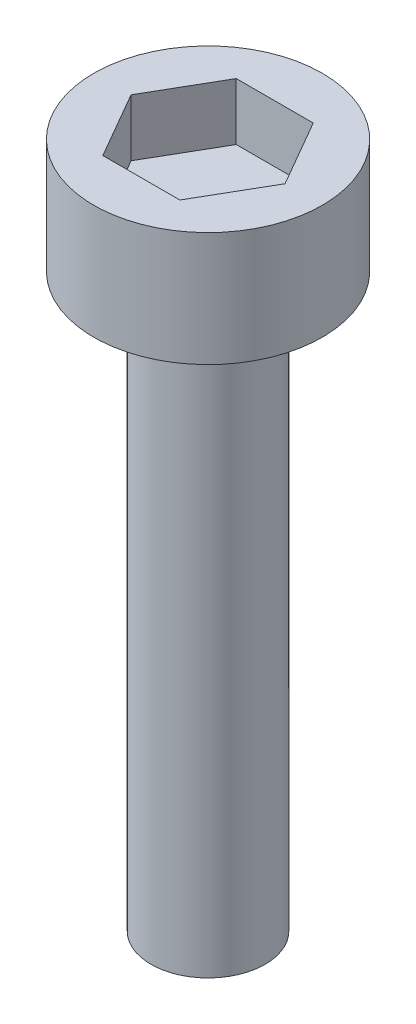
ISO-10303-21;
HEADER;
FILE_DESCRIPTION(('STEP AP214'),'2;1');
FILE_NAME('part.step','',(''),(''),'','','');
FILE_SCHEMA(('AUTOMOTIVE_DESIGN { 1 0 10303 214 1 1 1 1 }'));
ENDSEC;
DATA;
#1=APPLICATION_CONTEXT('core data for automotive mechanical design processes');
#2=APPLICATION_PROTOCOL_DEFINITION('international standard','automotive_design',2000,#1);
#3=PRODUCT_CONTEXT('',#1,'mechanical');
#4=PRODUCT('Part','Part','',(#3));
#5=PRODUCT_RELATED_PRODUCT_CATEGORY('part','',(#4));
#6=PRODUCT_DEFINITION_FORMATION('','',#4);
#7=PRODUCT_DEFINITION_CONTEXT('part definition',#1,'design');
#8=PRODUCT_DEFINITION('design','',#6,#7);
#9=PRODUCT_DEFINITION_SHAPE('','',#8);
#10=(LENGTH_UNIT() NAMED_UNIT(*) SI_UNIT(.MILLI.,.METRE.));
#11=(NAMED_UNIT(*) PLANE_ANGLE_UNIT() SI_UNIT($,.RADIAN.));
#12=(NAMED_UNIT(*) SI_UNIT($,.STERADIAN.) SOLID_ANGLE_UNIT());
#13=UNCERTAINTY_MEASURE_WITH_UNIT(LENGTH_MEASURE(1.E-05),#10,'distance_accuracy_value','');
#14=(GEOMETRIC_REPRESENTATION_CONTEXT(3) GLOBAL_UNCERTAINTY_ASSIGNED_CONTEXT((#13)) GLOBAL_UNIT_ASSIGNED_CONTEXT((#10,
#11,#12)) REPRESENTATION_CONTEXT('',''));
#15=CARTESIAN_POINT('',(0.,0.,0.));
#16=DIRECTION('',(0.,0.,1.));
#17=DIRECTION('',(1.,0.,0.));
#18=AXIS2_PLACEMENT_3D('',#15,#16,#17);
#19=CARTESIAN_POINT('',(0.,0.,0.));
#20=DIRECTION('',(0.,-1.,0.));
#21=DIRECTION('',(0.,0.,-1.));
#22=AXIS2_PLACEMENT_3D('',#19,#20,#21);
#23=PLANE('',#22);
#24=CARTESIAN_POINT('',(0.,0.,0.));
#25=DIRECTION('',(0.,-1.,0.));
#26=DIRECTION('',(0.,0.,-1.));
#27=AXIS2_PLACEMENT_3D('',#24,#25,#26);
#28=CIRCLE('',#27,3.);
#29=CARTESIAN_POINT('',(0.,0.,-3.));
#30=VERTEX_POINT('',#29);
#31=EDGE_CURVE('E11',#30,#30,#28,.T.);
#32=ORIENTED_EDGE('',*,*,#31,.T.);
#33=EDGE_LOOP('',(#32));
#34=FACE_BOUND('',#33,.T.);
#35=ADVANCED_FACE('F33',(#34),#23,.T.);
#36=CARTESIAN_POINT('',(0.,0.,0.));
#37=DIRECTION('',(0.,-1.,0.));
#38=DIRECTION('',(0.,0.,-1.));
#39=AXIS2_PLACEMENT_3D('',#36,#37,#38);
#40=CYLINDRICAL_SURFACE('',#39,3.);
#41=CARTESIAN_POINT('',(0.,30.,0.));
#42=DIRECTION('',(0.,-1.,0.));
#43=DIRECTION('',(0.,0.,-1.));
#44=AXIS2_PLACEMENT_3D('',#41,#42,#43);
#45=CIRCLE('',#44,3.);
#46=CARTESIAN_POINT('',(0.,30.,-3.));
#47=VERTEX_POINT('',#46);
#48=EDGE_CURVE('E40',#47,#47,#45,.T.);
#49=ORIENTED_EDGE('',*,*,#48,.T.);
#50=EDGE_LOOP('',(#49));
#51=FACE_BOUND('',#50,.T.);
#52=ORIENTED_EDGE('',*,*,#31,.F.);
#53=EDGE_LOOP('',(#52));
#54=FACE_BOUND('',#53,.T.);
#55=ADVANCED_FACE('F147',(#51,#54),#40,.T.);
#56=CARTESIAN_POINT('',(3.,30.,0.));
#57=DIRECTION('',(0.,-1.,0.));
#58=DIRECTION('',(0.,0.,-1.));
#59=AXIS2_PLACEMENT_3D('',#56,#57,#58);
#60=PLANE('',#59);
#61=CARTESIAN_POINT('',(0.,30.,0.));
#62=DIRECTION('',(0.,-1.,0.));
#63=DIRECTION('',(0.,0.,-1.));
#64=AXIS2_PLACEMENT_3D('',#61,#62,#63);
#65=CIRCLE('',#64,6.);
#66=CARTESIAN_POINT('',(0.,30.,-6.));
#67=VERTEX_POINT('',#66);
#68=EDGE_CURVE('E142',#67,#67,#65,.T.);
#69=ORIENTED_EDGE('',*,*,#68,.T.);
#70=EDGE_LOOP('',(#69));
#71=FACE_BOUND('',#70,.T.);
#72=ORIENTED_EDGE('',*,*,#48,.F.);
#73=EDGE_LOOP('',(#72));
#74=FACE_BOUND('',#73,.T.);
#75=ADVANCED_FACE('F150',(#71,#74),#60,.T.);
#76=CARTESIAN_POINT('',(0.,0.,0.));
#77=DIRECTION('',(0.,-1.,0.));
#78=DIRECTION('',(0.,0.,-1.));
#79=AXIS2_PLACEMENT_3D('',#76,#77,#78);
#80=CYLINDRICAL_SURFACE('',#79,6.);
#81=CARTESIAN_POINT('',(0.,36.,0.));
#82=DIRECTION('',(0.,-1.,0.));
#83=DIRECTION('',(0.,0.,-1.));
#84=AXIS2_PLACEMENT_3D('',#81,#82,#83);
#85=CIRCLE('',#84,6.);
#86=CARTESIAN_POINT('',(0.,36.,-6.));
#87=VERTEX_POINT('',#86);
#88=EDGE_CURVE('E134',#87,#87,#85,.T.);
#89=ORIENTED_EDGE('',*,*,#88,.T.);
#90=EDGE_LOOP('',(#89));
#91=FACE_BOUND('',#90,.T.);
#92=ORIENTED_EDGE('',*,*,#68,.F.);
#93=EDGE_LOOP('',(#92));
#94=FACE_BOUND('',#93,.T.);
#95=ADVANCED_FACE('F152',(#91,#94),#80,.T.);
#96=CARTESIAN_POINT('',(6.,36.,0.));
#97=DIRECTION('',(0.,1.,0.));
#98=DIRECTION('',(0.,0.,1.));
#99=AXIS2_PLACEMENT_3D('',#96,#97,#98);
#100=PLANE('',#99);
#101=DIRECTION('',(-0.5,0.,-0.866025403784439));
#102=VECTOR('',#101,1.);
#103=CARTESIAN_POINT('',(4.04145188432738,36.,0.));
#104=LINE('',#103,#102);
#105=CARTESIAN_POINT('',(4.04145188432738,36.,0.));
#106=VERTEX_POINT('',#105);
#107=CARTESIAN_POINT('',(2.02072594216369,36.,-3.5));
#108=VERTEX_POINT('',#107);
#109=EDGE_CURVE('E47',#106,#108,#104,.T.);
#110=ORIENTED_EDGE('',*,*,#109,.F.);
#111=DIRECTION('',(0.5,0.,-0.866025403784439));
#112=VECTOR('',#111,1.);
#113=CARTESIAN_POINT('',(2.02072594216369,36.,3.5));
#114=LINE('',#113,#112);
#115=CARTESIAN_POINT('',(2.02072594216369,36.,3.5));
#116=VERTEX_POINT('',#115);
#117=EDGE_CURVE('E130',#116,#106,#114,.T.);
#118=ORIENTED_EDGE('',*,*,#117,.F.);
#119=DIRECTION('',(1.,0.,0.));
#120=VECTOR('',#119,1.);
#121=CARTESIAN_POINT('',(-2.02072594216369,36.,3.5));
#122=LINE('',#121,#120);
#123=CARTESIAN_POINT('',(-2.02072594216369,36.,3.5));
#124=VERTEX_POINT('',#123);
#125=EDGE_CURVE('E128',#124,#116,#122,.T.);
#126=ORIENTED_EDGE('',*,*,#125,.F.);
#127=DIRECTION('',(0.5,0.,0.866025403784439));
#128=VECTOR('',#127,1.);
#129=CARTESIAN_POINT('',(-4.04145188432738,36.,0.));
#130=LINE('',#129,#128);
#131=CARTESIAN_POINT('',(-4.04145188432738,36.,0.));
#132=VERTEX_POINT('',#131);
#133=EDGE_CURVE('E95',#132,#124,#130,.T.);
#134=ORIENTED_EDGE('',*,*,#133,.F.);
#135=DIRECTION('',(-0.5,0.,0.866025403784439));
#136=VECTOR('',#135,1.);
#137=CARTESIAN_POINT('',(-2.02072594216369,36.,-3.5));
#138=LINE('',#137,#136);
#139=CARTESIAN_POINT('',(-2.02072594216369,36.,-3.5));
#140=VERTEX_POINT('',#139);
#141=EDGE_CURVE('E124',#140,#132,#138,.T.);
#142=ORIENTED_EDGE('',*,*,#141,.F.);
#143=DIRECTION('',(-1.,0.,0.));
#144=VECTOR('',#143,1.);
#145=CARTESIAN_POINT('',(2.02072594216369,36.,-3.5));
#146=LINE('',#145,#144);
#147=EDGE_CURVE('E121',#108,#140,#146,.T.);
#148=ORIENTED_EDGE('',*,*,#147,.F.);
#149=EDGE_LOOP('',(#110,#118,#126,#134,#142,#148));
#150=FACE_BOUND('',#149,.T.);
#151=ORIENTED_EDGE('',*,*,#88,.F.);
#152=EDGE_LOOP('',(#151));
#153=FACE_BOUND('',#152,.T.);
#154=ADVANCED_FACE('F159',(#150,#153),#100,.T.);
#155=CARTESIAN_POINT('',(4.04145188432738,33.,0.));
#156=DIRECTION('',(0.866025403784439,0.,-0.5));
#157=DIRECTION('',(-0.5,0.,-0.866025403784439));
#158=AXIS2_PLACEMENT_3D('',#155,#156,#157);
#159=PLANE('',#158);
#160=ORIENTED_EDGE('',*,*,#109,.T.);
#161=DIRECTION('',(0.,1.,0.));
#162=VECTOR('',#161,1.);
#163=CARTESIAN_POINT('',(2.02072594216369,33.,-3.5));
#164=LINE('',#163,#162);
#165=CARTESIAN_POINT('',(2.02072594216369,33.,-3.5));
#166=VERTEX_POINT('',#165);
#167=EDGE_CURVE('E77',#166,#108,#164,.T.);
#168=ORIENTED_EDGE('',*,*,#167,.F.);
#169=DIRECTION('',(-0.5,0.,-0.866025403784439));
#170=VECTOR('',#169,1.);
#171=CARTESIAN_POINT('',(4.04145188432738,33.,0.));
#172=LINE('',#171,#170);
#173=CARTESIAN_POINT('',(4.04145188432738,33.,0.));
#174=VERTEX_POINT('',#173);
#175=EDGE_CURVE('E132',#174,#166,#172,.T.);
#176=ORIENTED_EDGE('',*,*,#175,.F.);
#177=DIRECTION('',(0.,1.,0.));
#178=VECTOR('',#177,1.);
#179=CARTESIAN_POINT('',(4.04145188432738,33.,0.));
#180=LINE('',#179,#178);
#181=EDGE_CURVE('E55',#174,#106,#180,.T.);
#182=ORIENTED_EDGE('',*,*,#181,.T.);
#183=EDGE_LOOP('',(#160,#168,#176,#182));
#184=FACE_BOUND('',#183,.T.);
#185=ADVANCED_FACE('F190',(#184),#159,.F.);
#186=CARTESIAN_POINT('',(2.02072594216369,33.,3.5));
#187=DIRECTION('',(0.866025403784438,0.,0.5));
#188=DIRECTION('',(0.5,0.,-0.866025403784439));
#189=AXIS2_PLACEMENT_3D('',#186,#187,#188);
#190=PLANE('',#189);
#191=ORIENTED_EDGE('',*,*,#117,.T.);
#192=ORIENTED_EDGE('',*,*,#181,.F.);
#193=DIRECTION('',(0.5,0.,-0.866025403784439));
#194=VECTOR('',#193,1.);
#195=CARTESIAN_POINT('',(2.02072594216369,33.,3.5));
#196=LINE('',#195,#194);
#197=CARTESIAN_POINT('',(2.02072594216369,33.,3.5));
#198=VERTEX_POINT('',#197);
#199=EDGE_CURVE('E107',#198,#174,#196,.T.);
#200=ORIENTED_EDGE('',*,*,#199,.F.);
#201=DIRECTION('',(0.,1.,0.));
#202=VECTOR('',#201,1.);
#203=CARTESIAN_POINT('',(2.02072594216369,33.,3.5));
#204=LINE('',#203,#202);
#205=EDGE_CURVE('E99',#198,#116,#204,.T.);
#206=ORIENTED_EDGE('',*,*,#205,.T.);
#207=EDGE_LOOP('',(#191,#192,#200,#206));
#208=FACE_BOUND('',#207,.T.);
#209=ADVANCED_FACE('F200',(#208),#190,.F.);
#210=CARTESIAN_POINT('',(-2.02072594216369,33.,3.5));
#211=DIRECTION('',(0.,0.,1.));
#212=DIRECTION('',(1.,0.,0.));
#213=AXIS2_PLACEMENT_3D('',#210,#211,#212);
#214=PLANE('',#213);
#215=ORIENTED_EDGE('',*,*,#125,.T.);
#216=ORIENTED_EDGE('',*,*,#205,.F.);
#217=DIRECTION('',(1.,0.,0.));
#218=VECTOR('',#217,1.);
#219=CARTESIAN_POINT('',(-2.02072594216369,33.,3.5));
#220=LINE('',#219,#218);
#221=CARTESIAN_POINT('',(-2.02072594216369,33.,3.5));
#222=VERTEX_POINT('',#221);
#223=EDGE_CURVE('E103',#222,#198,#220,.T.);
#224=ORIENTED_EDGE('',*,*,#223,.F.);
#225=DIRECTION('',(0.,1.,0.));
#226=VECTOR('',#225,1.);
#227=CARTESIAN_POINT('',(-2.02072594216369,33.,3.5));
#228=LINE('',#227,#226);
#229=EDGE_CURVE('E88',#222,#124,#228,.T.);
#230=ORIENTED_EDGE('',*,*,#229,.T.);
#231=EDGE_LOOP('',(#215,#216,#224,#230));
#232=FACE_BOUND('',#231,.T.);
#233=ADVANCED_FACE('F104',(#232),#214,.F.);
#234=CARTESIAN_POINT('',(-4.04145188432738,33.,0.));
#235=DIRECTION('',(-0.866025403784439,0.,0.5));
#236=DIRECTION('',(0.5,0.,0.866025403784439));
#237=AXIS2_PLACEMENT_3D('',#234,#235,#236);
#238=PLANE('',#237);
#239=ORIENTED_EDGE('',*,*,#133,.T.);
#240=ORIENTED_EDGE('',*,*,#229,.F.);
#241=DIRECTION('',(0.5,0.,0.866025403784439));
#242=VECTOR('',#241,1.);
#243=CARTESIAN_POINT('',(-4.04145188432738,33.,0.));
#244=LINE('',#243,#242);
#245=CARTESIAN_POINT('',(-4.04145188432738,33.,0.));
#246=VERTEX_POINT('',#245);
#247=EDGE_CURVE('E92',#246,#222,#244,.T.);
#248=ORIENTED_EDGE('',*,*,#247,.F.);
#249=DIRECTION('',(0.,1.,0.));
#250=VECTOR('',#249,1.);
#251=CARTESIAN_POINT('',(-4.04145188432738,33.,0.));
#252=LINE('',#251,#250);
#253=EDGE_CURVE('E100',#246,#132,#252,.T.);
#254=ORIENTED_EDGE('',*,*,#253,.T.);
#255=EDGE_LOOP('',(#239,#240,#248,#254));
#256=FACE_BOUND('',#255,.T.);
#257=ADVANCED_FACE('F90',(#256),#238,.F.);
#258=CARTESIAN_POINT('',(-2.02072594216369,33.,-3.5));
#259=DIRECTION('',(-0.866025403784438,0.,-0.5));
#260=DIRECTION('',(-0.5,0.,0.866025403784439));
#261=AXIS2_PLACEMENT_3D('',#258,#259,#260);
#262=PLANE('',#261);
#263=ORIENTED_EDGE('',*,*,#141,.T.);
#264=ORIENTED_EDGE('',*,*,#253,.F.);
#265=DIRECTION('',(-0.5,0.,0.866025403784439));
#266=VECTOR('',#265,1.);
#267=CARTESIAN_POINT('',(-2.02072594216369,33.,-3.5));
#268=LINE('',#267,#266);
#269=CARTESIAN_POINT('',(-2.02072594216369,33.,-3.5));
#270=VERTEX_POINT('',#269);
#271=EDGE_CURVE('E113',#270,#246,#268,.T.);
#272=ORIENTED_EDGE('',*,*,#271,.F.);
#273=DIRECTION('',(0.,1.,0.));
#274=VECTOR('',#273,1.);
#275=CARTESIAN_POINT('',(-2.02072594216369,33.,-3.5));
#276=LINE('',#275,#274);
#277=EDGE_CURVE('E137',#270,#140,#276,.T.);
#278=ORIENTED_EDGE('',*,*,#277,.T.);
#279=EDGE_LOOP('',(#263,#264,#272,#278));
#280=FACE_BOUND('',#279,.T.);
#281=ADVANCED_FACE('F225',(#280),#262,.F.);
#282=CARTESIAN_POINT('',(2.02072594216369,33.,-3.5));
#283=DIRECTION('',(0.,0.,-1.));
#284=DIRECTION('',(-1.,0.,0.));
#285=AXIS2_PLACEMENT_3D('',#282,#283,#284);
#286=PLANE('',#285);
#287=ORIENTED_EDGE('',*,*,#147,.T.);
#288=ORIENTED_EDGE('',*,*,#277,.F.);
#289=DIRECTION('',(-1.,0.,0.));
#290=VECTOR('',#289,1.);
#291=CARTESIAN_POINT('',(2.02072594216369,33.,-3.5));
#292=LINE('',#291,#290);
#293=EDGE_CURVE('E115',#166,#270,#292,.T.);
#294=ORIENTED_EDGE('',*,*,#293,.F.);
#295=ORIENTED_EDGE('',*,*,#167,.T.);
#296=EDGE_LOOP('',(#287,#288,#294,#295));
#297=FACE_BOUND('',#296,.T.);
#298=ADVANCED_FACE('F234',(#297),#286,.F.);
#299=CARTESIAN_POINT('',(0.,33.,0.));
#300=DIRECTION('',(0.,1.,0.));
#301=DIRECTION('',(0.,0.,1.));
#302=AXIS2_PLACEMENT_3D('',#299,#300,#301);
#303=PLANE('',#302);
#304=ORIENTED_EDGE('',*,*,#175,.T.);
#305=ORIENTED_EDGE('',*,*,#293,.T.);
#306=ORIENTED_EDGE('',*,*,#271,.T.);
#307=ORIENTED_EDGE('',*,*,#247,.T.);
#308=ORIENTED_EDGE('',*,*,#223,.T.);
#309=ORIENTED_EDGE('',*,*,#199,.T.);
#310=EDGE_LOOP('',(#304,#305,#306,#307,#308,#309));
#311=FACE_BOUND('',#310,.T.);
#312=ADVANCED_FACE('F110',(#311),#303,.T.);
#313=CLOSED_SHELL('',(#35,#55,#75,#95,#154,#185,#209,#233,#257,#281,#298,#312));
#314=MANIFOLD_SOLID_BREP('B2',#313);
#315=ADVANCED_BREP_SHAPE_REPRESENTATION('',(#18,#314),#14);
#316=SHAPE_DEFINITION_REPRESENTATION(#9,#315);
ENDSEC;
END-ISO-10303-21;
